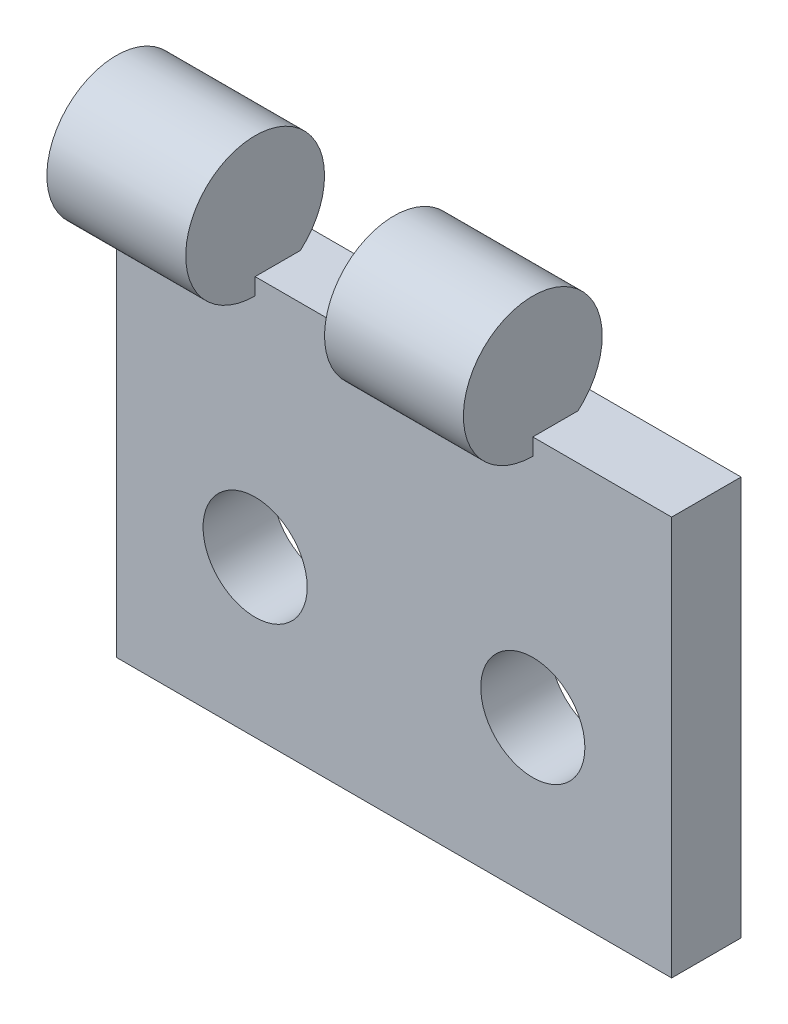
ISO-10303-21;
HEADER;
FILE_DESCRIPTION(('STEP AP214'),'2;1');
FILE_NAME('part.step','',(''),(''),'','','');
FILE_SCHEMA(('AUTOMOTIVE_DESIGN { 1 0 10303 214 1 1 1 1 }'));
ENDSEC;
DATA;
#1=APPLICATION_CONTEXT('core data for automotive mechanical design processes');
#2=APPLICATION_PROTOCOL_DEFINITION('international standard','automotive_design',2000,#1);
#3=PRODUCT_CONTEXT('',#1,'mechanical');
#4=PRODUCT('Part','Part','',(#3));
#5=PRODUCT_RELATED_PRODUCT_CATEGORY('part','',(#4));
#6=PRODUCT_DEFINITION_FORMATION('','',#4);
#7=PRODUCT_DEFINITION_CONTEXT('part definition',#1,'design');
#8=PRODUCT_DEFINITION('design','',#6,#7);
#9=PRODUCT_DEFINITION_SHAPE('','',#8);
#10=(LENGTH_UNIT() NAMED_UNIT(*) SI_UNIT(.MILLI.,.METRE.));
#11=(NAMED_UNIT(*) PLANE_ANGLE_UNIT() SI_UNIT($,.RADIAN.));
#12=(NAMED_UNIT(*) SI_UNIT($,.STERADIAN.) SOLID_ANGLE_UNIT());
#13=UNCERTAINTY_MEASURE_WITH_UNIT(LENGTH_MEASURE(1.E-05),#10,'distance_accuracy_value','');
#14=(GEOMETRIC_REPRESENTATION_CONTEXT(3) GLOBAL_UNCERTAINTY_ASSIGNED_CONTEXT((#13)) GLOBAL_UNIT_ASSIGNED_CONTEXT((#10,
#11,#12)) REPRESENTATION_CONTEXT('',''));
#15=CARTESIAN_POINT('',(0.,0.,0.));
#16=DIRECTION('',(0.,0.,1.));
#17=DIRECTION('',(1.,0.,0.));
#18=AXIS2_PLACEMENT_3D('',#15,#16,#17);
#19=CARTESIAN_POINT('',(0.,11.5,2.));
#20=DIRECTION('',(0.,-1.,0.));
#21=DIRECTION('',(0.,0.,-1.));
#22=AXIS2_PLACEMENT_3D('',#19,#20,#21);
#23=PLANE('',#22);
#24=DIRECTION('',(-1.,0.,0.));
#25=VECTOR('',#24,1.);
#26=CARTESIAN_POINT('',(12.,11.5,0.697745910079163));
#27=LINE('',#26,#25);
#28=CARTESIAN_POINT('',(12.,11.5,0.697745910079163));
#29=VERTEX_POINT('',#28);
#30=CARTESIAN_POINT('',(8.,11.5,0.697745910079163));
#31=VERTEX_POINT('',#30);
#32=EDGE_CURVE('E49',#29,#31,#27,.T.);
#33=ORIENTED_EDGE('',*,*,#32,.F.);
#34=DIRECTION('',(0.,0.,1.));
#35=VECTOR('',#34,1.);
#36=CARTESIAN_POINT('',(12.,11.5,2.));
#37=LINE('',#36,#35);
#38=CARTESIAN_POINT('',(12.,11.5,2.));
#39=VERTEX_POINT('',#38);
#40=EDGE_CURVE('E127',#29,#39,#37,.T.);
#41=ORIENTED_EDGE('',*,*,#40,.T.);
#42=DIRECTION('',(-1.,0.,0.));
#43=VECTOR('',#42,1.);
#44=CARTESIAN_POINT('',(0.,11.5,2.));
#45=LINE('',#44,#43);
#46=CARTESIAN_POINT('',(16.,11.5,2.));
#47=VERTEX_POINT('',#46);
#48=EDGE_CURVE('E151',#47,#39,#45,.T.);
#49=ORIENTED_EDGE('',*,*,#48,.F.);
#50=DIRECTION('',(0.,0.,-1.));
#51=VECTOR('',#50,1.);
#52=CARTESIAN_POINT('',(16.,11.5,2.));
#53=LINE('',#52,#51);
#54=CARTESIAN_POINT('',(16.,11.5,0.));
#55=VERTEX_POINT('',#54);
#56=EDGE_CURVE('E163',#47,#55,#53,.T.);
#57=ORIENTED_EDGE('',*,*,#56,.T.);
#58=DIRECTION('',(-1.,0.,0.));
#59=VECTOR('',#58,1.);
#60=CARTESIAN_POINT('',(0.,11.5,0.));
#61=LINE('',#60,#59);
#62=CARTESIAN_POINT('',(0.,11.5,0.));
#63=VERTEX_POINT('',#62);
#64=EDGE_CURVE('E146',#55,#63,#61,.T.);
#65=ORIENTED_EDGE('',*,*,#64,.T.);
#66=DIRECTION('',(0.,0.,-1.));
#67=VECTOR('',#66,1.);
#68=CARTESIAN_POINT('',(0.,11.5,2.));
#69=LINE('',#68,#67);
#70=CARTESIAN_POINT('',(0.,11.5,0.697745910079163));
#71=VERTEX_POINT('',#70);
#72=EDGE_CURVE('E153',#71,#63,#69,.T.);
#73=ORIENTED_EDGE('',*,*,#72,.F.);
#74=DIRECTION('',(-1.,0.,0.));
#75=VECTOR('',#74,1.);
#76=CARTESIAN_POINT('',(4.,11.5,0.697745910079163));
#77=LINE('',#76,#75);
#78=CARTESIAN_POINT('',(4.,11.5,0.697745910079163));
#79=VERTEX_POINT('',#78);
#80=EDGE_CURVE('E139',#79,#71,#77,.T.);
#81=ORIENTED_EDGE('',*,*,#80,.F.);
#82=DIRECTION('',(0.,0.,1.));
#83=VECTOR('',#82,1.);
#84=CARTESIAN_POINT('',(4.,11.5,2.));
#85=LINE('',#84,#83);
#86=CARTESIAN_POINT('',(4.,11.5,2.));
#87=VERTEX_POINT('',#86);
#88=EDGE_CURVE('E134',#79,#87,#85,.T.);
#89=ORIENTED_EDGE('',*,*,#88,.T.);
#90=CARTESIAN_POINT('',(8.,11.5,2.));
#91=VERTEX_POINT('',#90);
#92=EDGE_CURVE('E150',#91,#87,#45,.T.);
#93=ORIENTED_EDGE('',*,*,#92,.F.);
#94=DIRECTION('',(0.,0.,1.));
#95=VECTOR('',#94,1.);
#96=CARTESIAN_POINT('',(8.,11.5,2.));
#97=LINE('',#96,#95);
#98=EDGE_CURVE('E54',#31,#91,#97,.T.);
#99=ORIENTED_EDGE('',*,*,#98,.F.);
#100=EDGE_LOOP('',(#33,#41,#49,#57,#65,#73,#81,#89,#93,#99));
#101=FACE_BOUND('',#100,.T.);
#102=ADVANCED_FACE('F34',(#101),#23,.F.);
#103=CARTESIAN_POINT('',(0.,0.,2.));
#104=DIRECTION('',(0.,0.,-1.));
#105=DIRECTION('',(-1.,0.,0.));
#106=AXIS2_PLACEMENT_3D('',#103,#104,#105);
#107=PLANE('',#106);
#108=CARTESIAN_POINT('',(4.,4.5,2.));
#109=DIRECTION('',(0.,0.,1.));
#110=DIRECTION('',(1.,0.,0.));
#111=AXIS2_PLACEMENT_3D('',#108,#109,#110);
#112=CIRCLE('',#111,1.49999999999999);
#113=CARTESIAN_POINT('',(5.49999999999999,4.5,2.));
#114=VERTEX_POINT('',#113);
#115=EDGE_CURVE('E273',#114,#114,#112,.T.);
#116=ORIENTED_EDGE('',*,*,#115,.F.);
#117=EDGE_LOOP('',(#116));
#118=FACE_BOUND('',#117,.T.);
#119=CARTESIAN_POINT('',(12.,4.5,2.));
#120=DIRECTION('',(0.,0.,1.));
#121=DIRECTION('',(1.,0.,0.));
#122=AXIS2_PLACEMENT_3D('',#119,#120,#121);
#123=CIRCLE('',#122,1.49999999999999);
#124=CARTESIAN_POINT('',(13.5,4.5,2.));
#125=VERTEX_POINT('',#124);
#126=EDGE_CURVE('E123',#125,#125,#123,.T.);
#127=ORIENTED_EDGE('',*,*,#126,.F.);
#128=EDGE_LOOP('',(#127));
#129=FACE_BOUND('',#128,.T.);
#130=ORIENTED_EDGE('',*,*,#48,.T.);
#131=DIRECTION('',(0.,-1.,0.));
#132=VECTOR('',#131,1.);
#133=CARTESIAN_POINT('',(12.,0.,2.));
#134=LINE('',#133,#132);
#135=CARTESIAN_POINT('',(12.,11.0179375103358,2.));
#136=VERTEX_POINT('',#135);
#137=EDGE_CURVE('E11',#39,#136,#134,.T.);
#138=ORIENTED_EDGE('',*,*,#137,.T.);
#139=DIRECTION('',(-1.,0.,0.));
#140=VECTOR('',#139,1.);
#141=CARTESIAN_POINT('',(12.,11.0179375103358,2.));
#142=LINE('',#141,#140);
#143=CARTESIAN_POINT('',(8.,11.0179375103358,2.));
#144=VERTEX_POINT('',#143);
#145=EDGE_CURVE('E42',#144,#136,#142,.F.);
#146=ORIENTED_EDGE('',*,*,#145,.F.);
#147=DIRECTION('',(0.,-1.,0.));
#148=VECTOR('',#147,1.);
#149=CARTESIAN_POINT('',(8.,0.,2.));
#150=LINE('',#149,#148);
#151=EDGE_CURVE('E105',#91,#144,#150,.T.);
#152=ORIENTED_EDGE('',*,*,#151,.F.);
#153=ORIENTED_EDGE('',*,*,#92,.T.);
#154=DIRECTION('',(0.,-1.,0.));
#155=VECTOR('',#154,1.);
#156=CARTESIAN_POINT('',(4.,0.,2.));
#157=LINE('',#156,#155);
#158=CARTESIAN_POINT('',(4.,11.0179375103358,2.));
#159=VERTEX_POINT('',#158);
#160=EDGE_CURVE('E172',#87,#159,#157,.T.);
#161=ORIENTED_EDGE('',*,*,#160,.T.);
#162=DIRECTION('',(-1.,0.,0.));
#163=VECTOR('',#162,1.);
#164=CARTESIAN_POINT('',(4.,11.0179375103358,2.));
#165=LINE('',#164,#163);
#166=CARTESIAN_POINT('',(0.,11.0179375103358,2.));
#167=VERTEX_POINT('',#166);
#168=EDGE_CURVE('E115',#167,#159,#165,.F.);
#169=ORIENTED_EDGE('',*,*,#168,.F.);
#170=DIRECTION('',(0.,-1.,0.));
#171=VECTOR('',#170,1.);
#172=CARTESIAN_POINT('',(0.,0.,2.));
#173=LINE('',#172,#171);
#174=CARTESIAN_POINT('',(0.,0.,2.));
#175=VERTEX_POINT('',#174);
#176=EDGE_CURVE('E143',#167,#175,#173,.T.);
#177=ORIENTED_EDGE('',*,*,#176,.T.);
#178=DIRECTION('',(1.,0.,0.));
#179=VECTOR('',#178,1.);
#180=CARTESIAN_POINT('',(0.,0.,2.));
#181=LINE('',#180,#179);
#182=CARTESIAN_POINT('',(16.,0.,2.));
#183=VERTEX_POINT('',#182);
#184=EDGE_CURVE('E145',#175,#183,#181,.T.);
#185=ORIENTED_EDGE('',*,*,#184,.T.);
#186=DIRECTION('',(0.,1.,0.));
#187=VECTOR('',#186,1.);
#188=CARTESIAN_POINT('',(16.,0.,2.));
#189=LINE('',#188,#187);
#190=EDGE_CURVE('E148',#183,#47,#189,.T.);
#191=ORIENTED_EDGE('',*,*,#190,.T.);
#192=EDGE_LOOP('',(#130,#138,#146,#152,#153,#161,#169,#177,#185,#191));
#193=FACE_BOUND('',#192,.T.);
#194=ADVANCED_FACE('F104',(#118,#129,#193),#107,.F.);
#195=CARTESIAN_POINT('',(0.,0.,2.));
#196=DIRECTION('',(1.,0.,0.));
#197=DIRECTION('',(0.,0.,-1.));
#198=AXIS2_PLACEMENT_3D('',#195,#196,#197);
#199=PLANE('',#198);
#200=ORIENTED_EDGE('',*,*,#176,.F.);
#201=CARTESIAN_POINT('',(0.,13.0179375103358,2.));
#202=DIRECTION('',(1.,0.,0.));
#203=DIRECTION('',(0.,0.,-1.));
#204=AXIS2_PLACEMENT_3D('',#201,#202,#203);
#205=CIRCLE('',#204,2.);
#206=EDGE_CURVE('E130',#71,#167,#205,.T.);
#207=ORIENTED_EDGE('',*,*,#206,.F.);
#208=ORIENTED_EDGE('',*,*,#72,.T.);
#209=DIRECTION('',(0.,-1.,0.));
#210=VECTOR('',#209,1.);
#211=CARTESIAN_POINT('',(0.,0.,0.));
#212=LINE('',#211,#210);
#213=CARTESIAN_POINT('',(0.,0.,0.));
#214=VERTEX_POINT('',#213);
#215=EDGE_CURVE('E142',#63,#214,#212,.T.);
#216=ORIENTED_EDGE('',*,*,#215,.T.);
#217=DIRECTION('',(0.,0.,-1.));
#218=VECTOR('',#217,1.);
#219=CARTESIAN_POINT('',(0.,0.,2.));
#220=LINE('',#219,#218);
#221=EDGE_CURVE('E169',#175,#214,#220,.T.);
#222=ORIENTED_EDGE('',*,*,#221,.F.);
#223=EDGE_LOOP('',(#200,#207,#208,#216,#222));
#224=FACE_BOUND('',#223,.T.);
#225=ADVANCED_FACE('F36',(#224),#199,.F.);
#226=CARTESIAN_POINT('',(0.,0.,2.));
#227=DIRECTION('',(0.,1.,0.));
#228=DIRECTION('',(0.,0.,1.));
#229=AXIS2_PLACEMENT_3D('',#226,#227,#228);
#230=PLANE('',#229);
#231=DIRECTION('',(1.,0.,0.));
#232=VECTOR('',#231,1.);
#233=CARTESIAN_POINT('',(0.,0.,0.));
#234=LINE('',#233,#232);
#235=CARTESIAN_POINT('',(16.,0.,0.));
#236=VERTEX_POINT('',#235);
#237=EDGE_CURVE('E156',#214,#236,#234,.T.);
#238=ORIENTED_EDGE('',*,*,#237,.T.);
#239=DIRECTION('',(0.,0.,-1.));
#240=VECTOR('',#239,1.);
#241=CARTESIAN_POINT('',(16.,0.,2.));
#242=LINE('',#241,#240);
#243=EDGE_CURVE('E166',#183,#236,#242,.T.);
#244=ORIENTED_EDGE('',*,*,#243,.F.);
#245=ORIENTED_EDGE('',*,*,#184,.F.);
#246=ORIENTED_EDGE('',*,*,#221,.T.);
#247=EDGE_LOOP('',(#238,#244,#245,#246));
#248=FACE_BOUND('',#247,.T.);
#249=ADVANCED_FACE('F189',(#248),#230,.F.);
#250=CARTESIAN_POINT('',(16.,0.,2.));
#251=DIRECTION('',(-1.,0.,0.));
#252=DIRECTION('',(0.,0.,1.));
#253=AXIS2_PLACEMENT_3D('',#250,#251,#252);
#254=PLANE('',#253);
#255=DIRECTION('',(0.,1.,0.));
#256=VECTOR('',#255,1.);
#257=CARTESIAN_POINT('',(16.,0.,0.));
#258=LINE('',#257,#256);
#259=EDGE_CURVE('E158',#236,#55,#258,.T.);
#260=ORIENTED_EDGE('',*,*,#259,.T.);
#261=ORIENTED_EDGE('',*,*,#56,.F.);
#262=ORIENTED_EDGE('',*,*,#190,.F.);
#263=ORIENTED_EDGE('',*,*,#243,.T.);
#264=EDGE_LOOP('',(#260,#261,#262,#263));
#265=FACE_BOUND('',#264,.T.);
#266=ADVANCED_FACE('F194',(#265),#254,.F.);
#267=CARTESIAN_POINT('',(0.,0.,0.));
#268=DIRECTION('',(0.,0.,-1.));
#269=DIRECTION('',(-1.,0.,0.));
#270=AXIS2_PLACEMENT_3D('',#267,#268,#269);
#271=PLANE('',#270);
#272=CARTESIAN_POINT('',(4.,4.5,0.));
#273=DIRECTION('',(0.,0.,1.));
#274=DIRECTION('',(1.,0.,0.));
#275=AXIS2_PLACEMENT_3D('',#272,#273,#274);
#276=CIRCLE('',#275,1.5);
#277=CARTESIAN_POINT('',(5.5,4.5,0.));
#278=VERTEX_POINT('',#277);
#279=EDGE_CURVE('E270',#278,#278,#276,.T.);
#280=ORIENTED_EDGE('',*,*,#279,.T.);
#281=EDGE_LOOP('',(#280));
#282=FACE_BOUND('',#281,.T.);
#283=CARTESIAN_POINT('',(12.,4.5,0.));
#284=DIRECTION('',(0.,0.,1.));
#285=DIRECTION('',(1.,0.,0.));
#286=AXIS2_PLACEMENT_3D('',#283,#284,#285);
#287=CIRCLE('',#286,1.5);
#288=CARTESIAN_POINT('',(13.5,4.5,0.));
#289=VERTEX_POINT('',#288);
#290=EDGE_CURVE('E119',#289,#289,#287,.T.);
#291=ORIENTED_EDGE('',*,*,#290,.T.);
#292=EDGE_LOOP('',(#291));
#293=FACE_BOUND('',#292,.T.);
#294=ORIENTED_EDGE('',*,*,#215,.F.);
#295=ORIENTED_EDGE('',*,*,#64,.F.);
#296=ORIENTED_EDGE('',*,*,#259,.F.);
#297=ORIENTED_EDGE('',*,*,#237,.F.);
#298=EDGE_LOOP('',(#294,#295,#296,#297));
#299=FACE_BOUND('',#298,.T.);
#300=ADVANCED_FACE('F217',(#282,#293,#299),#271,.T.);
#301=CARTESIAN_POINT('',(4.,13.0179375103358,2.));
#302=DIRECTION('',(-1.,0.,0.));
#303=DIRECTION('',(0.,0.,1.));
#304=AXIS2_PLACEMENT_3D('',#301,#302,#303);
#305=CYLINDRICAL_SURFACE('',#304,2.);
#306=CARTESIAN_POINT('',(4.,13.0179375103358,2.));
#307=DIRECTION('',(1.,0.,0.));
#308=DIRECTION('',(0.,0.,-1.));
#309=AXIS2_PLACEMENT_3D('',#306,#307,#308);
#310=CIRCLE('',#309,2.);
#311=EDGE_CURVE('E131',#79,#159,#310,.T.);
#312=ORIENTED_EDGE('',*,*,#311,.F.);
#313=ORIENTED_EDGE('',*,*,#80,.T.);
#314=ORIENTED_EDGE('',*,*,#206,.T.);
#315=ORIENTED_EDGE('',*,*,#168,.T.);
#316=EDGE_LOOP('',(#312,#313,#314,#315));
#317=FACE_BOUND('',#316,.T.);
#318=ADVANCED_FACE('F178',(#317),#305,.T.);
#319=CARTESIAN_POINT('',(4.,13.0179375103358,2.));
#320=DIRECTION('',(1.,0.,0.));
#321=DIRECTION('',(0.,0.,-1.));
#322=AXIS2_PLACEMENT_3D('',#319,#320,#321);
#323=PLANE('',#322);
#324=ORIENTED_EDGE('',*,*,#88,.F.);
#325=ORIENTED_EDGE('',*,*,#311,.T.);
#326=ORIENTED_EDGE('',*,*,#160,.F.);
#327=EDGE_LOOP('',(#324,#325,#326));
#328=FACE_BOUND('',#327,.T.);
#329=ADVANCED_FACE('F183',(#328),#323,.T.);
#330=CARTESIAN_POINT('',(12.,13.0179375103358,2.));
#331=DIRECTION('',(-1.,0.,0.));
#332=DIRECTION('',(0.,0.,1.));
#333=AXIS2_PLACEMENT_3D('',#330,#331,#332);
#334=CYLINDRICAL_SURFACE('',#333,2.);
#335=CARTESIAN_POINT('',(12.,13.0179375103358,2.));
#336=DIRECTION('',(1.,0.,0.));
#337=DIRECTION('',(0.,0.,-1.));
#338=AXIS2_PLACEMENT_3D('',#335,#336,#337);
#339=CIRCLE('',#338,2.);
#340=EDGE_CURVE('E118',#29,#136,#339,.T.);
#341=ORIENTED_EDGE('',*,*,#340,.F.);
#342=ORIENTED_EDGE('',*,*,#32,.T.);
#343=CARTESIAN_POINT('',(8.,13.0179375103358,2.));
#344=DIRECTION('',(1.,0.,0.));
#345=DIRECTION('',(0.,0.,-1.));
#346=AXIS2_PLACEMENT_3D('',#343,#344,#345);
#347=CIRCLE('',#346,2.);
#348=EDGE_CURVE('E114',#31,#144,#347,.T.);
#349=ORIENTED_EDGE('',*,*,#348,.T.);
#350=ORIENTED_EDGE('',*,*,#145,.T.);
#351=EDGE_LOOP('',(#341,#342,#349,#350));
#352=FACE_BOUND('',#351,.T.);
#353=ADVANCED_FACE('F117',(#352),#334,.T.);
#354=CARTESIAN_POINT('',(12.,13.0179375103358,2.));
#355=DIRECTION('',(1.,0.,0.));
#356=DIRECTION('',(0.,0.,-1.));
#357=AXIS2_PLACEMENT_3D('',#354,#355,#356);
#358=PLANE('',#357);
#359=ORIENTED_EDGE('',*,*,#40,.F.);
#360=ORIENTED_EDGE('',*,*,#340,.T.);
#361=ORIENTED_EDGE('',*,*,#137,.F.);
#362=EDGE_LOOP('',(#359,#360,#361));
#363=FACE_BOUND('',#362,.T.);
#364=ADVANCED_FACE('F197',(#363),#358,.T.);
#365=CARTESIAN_POINT('',(8.,13.0179375103358,2.));
#366=DIRECTION('',(1.,0.,0.));
#367=DIRECTION('',(0.,0.,-1.));
#368=AXIS2_PLACEMENT_3D('',#365,#366,#367);
#369=PLANE('',#368);
#370=ORIENTED_EDGE('',*,*,#348,.F.);
#371=ORIENTED_EDGE('',*,*,#98,.T.);
#372=ORIENTED_EDGE('',*,*,#151,.T.);
#373=EDGE_LOOP('',(#370,#371,#372));
#374=FACE_BOUND('',#373,.T.);
#375=ADVANCED_FACE('F113',(#374),#369,.F.);
#376=CARTESIAN_POINT('',(12.,4.5,2.));
#377=DIRECTION('',(0.,0.,1.));
#378=DIRECTION('',(1.,0.,0.));
#379=AXIS2_PLACEMENT_3D('',#376,#377,#378);
#380=CYLINDRICAL_SURFACE('',#379,1.49999999999999);
#381=ORIENTED_EDGE('',*,*,#290,.F.);
#382=EDGE_LOOP('',(#381));
#383=FACE_BOUND('',#382,.T.);
#384=ORIENTED_EDGE('',*,*,#126,.T.);
#385=EDGE_LOOP('',(#384));
#386=FACE_BOUND('',#385,.T.);
#387=ADVANCED_FACE('F204',(#383,#386),#380,.F.);
#388=CARTESIAN_POINT('',(4.,4.5,2.));
#389=DIRECTION('',(0.,0.,1.));
#390=DIRECTION('',(1.,0.,0.));
#391=AXIS2_PLACEMENT_3D('',#388,#389,#390);
#392=CYLINDRICAL_SURFACE('',#391,1.49999999999999);
#393=ORIENTED_EDGE('',*,*,#279,.F.);
#394=EDGE_LOOP('',(#393));
#395=FACE_BOUND('',#394,.T.);
#396=ORIENTED_EDGE('',*,*,#115,.T.);
#397=EDGE_LOOP('',(#396));
#398=FACE_BOUND('',#397,.T.);
#399=ADVANCED_FACE('F254',(#395,#398),#392,.F.);
#400=CLOSED_SHELL('',(#102,#194,#225,#249,#266,#300,#318,#329,#353,#364,#375,#387,#399));
#401=MANIFOLD_SOLID_BREP('B2',#400);
#402=ADVANCED_BREP_SHAPE_REPRESENTATION('',(#18,#401),#14);
#403=SHAPE_DEFINITION_REPRESENTATION(#9,#402);
ENDSEC;
END-ISO-10303-21;
